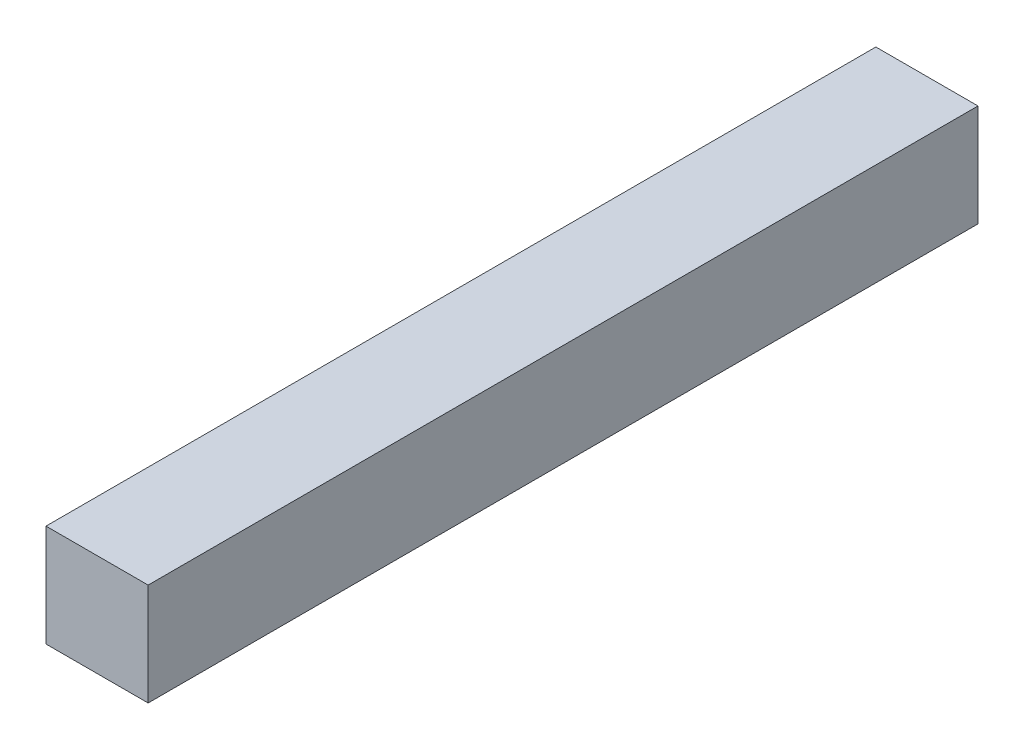
ISO-10303-21;
HEADER;
FILE_DESCRIPTION(('STEP AP214'),'2;1');
FILE_NAME('part.step','',(''),(''),'','','');
FILE_SCHEMA(('AUTOMOTIVE_DESIGN { 1 0 10303 214 1 1 1 1 }'));
ENDSEC;
DATA;
#1=APPLICATION_CONTEXT('core data for automotive mechanical design processes');
#2=APPLICATION_PROTOCOL_DEFINITION('international standard','automotive_design',2000,#1);
#3=PRODUCT_CONTEXT('',#1,'mechanical');
#4=PRODUCT('Part','Part','',(#3));
#5=PRODUCT_RELATED_PRODUCT_CATEGORY('part','',(#4));
#6=PRODUCT_DEFINITION_FORMATION('','',#4);
#7=PRODUCT_DEFINITION_CONTEXT('part definition',#1,'design');
#8=PRODUCT_DEFINITION('design','',#6,#7);
#9=PRODUCT_DEFINITION_SHAPE('','',#8);
#10=(LENGTH_UNIT() NAMED_UNIT(*) SI_UNIT(.MILLI.,.METRE.));
#11=(NAMED_UNIT(*) PLANE_ANGLE_UNIT() SI_UNIT($,.RADIAN.));
#12=(NAMED_UNIT(*) SI_UNIT($,.STERADIAN.) SOLID_ANGLE_UNIT());
#13=UNCERTAINTY_MEASURE_WITH_UNIT(LENGTH_MEASURE(1.E-05),#10,'distance_accuracy_value','');
#14=(GEOMETRIC_REPRESENTATION_CONTEXT(3) GLOBAL_UNCERTAINTY_ASSIGNED_CONTEXT((#13)) GLOBAL_UNIT_ASSIGNED_CONTEXT((#10,
#11,#12)) REPRESENTATION_CONTEXT('',''));
#15=CARTESIAN_POINT('',(0.,0.,0.));
#16=DIRECTION('',(0.,0.,1.));
#17=DIRECTION('',(1.,0.,0.));
#18=AXIS2_PLACEMENT_3D('',#15,#16,#17);
#19=CARTESIAN_POINT('',(0.,0.,65.));
#20=DIRECTION('',(1.,0.,0.));
#21=DIRECTION('',(0.,0.,-1.));
#22=AXIS2_PLACEMENT_3D('',#19,#20,#21);
#23=PLANE('',#22);
#24=DIRECTION('',(0.,-1.,0.));
#25=VECTOR('',#24,1.);
#26=CARTESIAN_POINT('',(0.,0.,0.));
#27=LINE('',#26,#25);
#28=CARTESIAN_POINT('',(0.,8.,0.));
#29=VERTEX_POINT('',#28);
#30=CARTESIAN_POINT('',(0.,0.,0.));
#31=VERTEX_POINT('',#30);
#32=EDGE_CURVE('E107',#29,#31,#27,.T.);
#33=ORIENTED_EDGE('',*,*,#32,.T.);
#34=DIRECTION('',(0.,0.,-1.));
#35=VECTOR('',#34,1.);
#36=CARTESIAN_POINT('',(0.,0.,65.));
#37=LINE('',#36,#35);
#38=CARTESIAN_POINT('',(0.,0.,65.));
#39=VERTEX_POINT('',#38);
#40=EDGE_CURVE('E11',#39,#31,#37,.T.);
#41=ORIENTED_EDGE('',*,*,#40,.F.);
#42=DIRECTION('',(0.,-1.,0.));
#43=VECTOR('',#42,1.);
#44=CARTESIAN_POINT('',(0.,0.,65.));
#45=LINE('',#44,#43);
#46=CARTESIAN_POINT('',(0.,8.,65.));
#47=VERTEX_POINT('',#46);
#48=EDGE_CURVE('E91',#47,#39,#45,.T.);
#49=ORIENTED_EDGE('',*,*,#48,.F.);
#50=DIRECTION('',(0.,0.,-1.));
#51=VECTOR('',#50,1.);
#52=CARTESIAN_POINT('',(0.,8.,65.));
#53=LINE('',#52,#51);
#54=EDGE_CURVE('E103',#47,#29,#53,.T.);
#55=ORIENTED_EDGE('',*,*,#54,.T.);
#56=EDGE_LOOP('',(#33,#41,#49,#55));
#57=FACE_BOUND('',#56,.T.);
#58=ADVANCED_FACE('F39',(#57),#23,.F.);
#59=CARTESIAN_POINT('',(0.,0.,65.));
#60=DIRECTION('',(0.,1.,0.));
#61=DIRECTION('',(0.,0.,1.));
#62=AXIS2_PLACEMENT_3D('',#59,#60,#61);
#63=PLANE('',#62);
#64=DIRECTION('',(1.,0.,0.));
#65=VECTOR('',#64,1.);
#66=CARTESIAN_POINT('',(0.,0.,0.));
#67=LINE('',#66,#65);
#68=CARTESIAN_POINT('',(8.,0.,0.));
#69=VERTEX_POINT('',#68);
#70=EDGE_CURVE('E96',#31,#69,#67,.T.);
#71=ORIENTED_EDGE('',*,*,#70,.T.);
#72=DIRECTION('',(0.,0.,-1.));
#73=VECTOR('',#72,1.);
#74=CARTESIAN_POINT('',(8.,0.,65.));
#75=LINE('',#74,#73);
#76=CARTESIAN_POINT('',(8.,0.,65.));
#77=VERTEX_POINT('',#76);
#78=EDGE_CURVE('E48',#77,#69,#75,.T.);
#79=ORIENTED_EDGE('',*,*,#78,.F.);
#80=DIRECTION('',(1.,0.,0.));
#81=VECTOR('',#80,1.);
#82=CARTESIAN_POINT('',(0.,0.,65.));
#83=LINE('',#82,#81);
#84=EDGE_CURVE('E86',#39,#77,#83,.T.);
#85=ORIENTED_EDGE('',*,*,#84,.F.);
#86=ORIENTED_EDGE('',*,*,#40,.T.);
#87=EDGE_LOOP('',(#71,#79,#85,#86));
#88=FACE_BOUND('',#87,.T.);
#89=ADVANCED_FACE('F95',(#88),#63,.F.);
#90=CARTESIAN_POINT('',(8.,0.,65.));
#91=DIRECTION('',(-1.,0.,0.));
#92=DIRECTION('',(0.,0.,1.));
#93=AXIS2_PLACEMENT_3D('',#90,#91,#92);
#94=PLANE('',#93);
#95=DIRECTION('',(0.,1.,0.));
#96=VECTOR('',#95,1.);
#97=CARTESIAN_POINT('',(8.,0.,0.));
#98=LINE('',#97,#96);
#99=CARTESIAN_POINT('',(8.,8.,0.));
#100=VERTEX_POINT('',#99);
#101=EDGE_CURVE('E73',#69,#100,#98,.T.);
#102=ORIENTED_EDGE('',*,*,#101,.T.);
#103=DIRECTION('',(0.,0.,-1.));
#104=VECTOR('',#103,1.);
#105=CARTESIAN_POINT('',(8.,8.,65.));
#106=LINE('',#105,#104);
#107=CARTESIAN_POINT('',(8.,8.,65.));
#108=VERTEX_POINT('',#107);
#109=EDGE_CURVE('E98',#108,#100,#106,.T.);
#110=ORIENTED_EDGE('',*,*,#109,.F.);
#111=DIRECTION('',(0.,1.,0.));
#112=VECTOR('',#111,1.);
#113=CARTESIAN_POINT('',(8.,0.,65.));
#114=LINE('',#113,#112);
#115=EDGE_CURVE('E89',#77,#108,#114,.T.);
#116=ORIENTED_EDGE('',*,*,#115,.F.);
#117=ORIENTED_EDGE('',*,*,#78,.T.);
#118=EDGE_LOOP('',(#102,#110,#116,#117));
#119=FACE_BOUND('',#118,.T.);
#120=ADVANCED_FACE('F99',(#119),#94,.F.);
#121=CARTESIAN_POINT('',(0.,8.,65.));
#122=DIRECTION('',(0.,-1.,0.));
#123=DIRECTION('',(0.,0.,-1.));
#124=AXIS2_PLACEMENT_3D('',#121,#122,#123);
#125=PLANE('',#124);
#126=DIRECTION('',(-1.,0.,0.));
#127=VECTOR('',#126,1.);
#128=CARTESIAN_POINT('',(0.,8.,0.));
#129=LINE('',#128,#127);
#130=EDGE_CURVE('E79',#100,#29,#129,.T.);
#131=ORIENTED_EDGE('',*,*,#130,.T.);
#132=ORIENTED_EDGE('',*,*,#54,.F.);
#133=DIRECTION('',(-1.,0.,0.));
#134=VECTOR('',#133,1.);
#135=CARTESIAN_POINT('',(0.,8.,65.));
#136=LINE('',#135,#134);
#137=EDGE_CURVE('E56',#108,#47,#136,.T.);
#138=ORIENTED_EDGE('',*,*,#137,.F.);
#139=ORIENTED_EDGE('',*,*,#109,.T.);
#140=EDGE_LOOP('',(#131,#132,#138,#139));
#141=FACE_BOUND('',#140,.T.);
#142=ADVANCED_FACE('F120',(#141),#125,.F.);
#143=CARTESIAN_POINT('',(0.,0.,65.));
#144=DIRECTION('',(0.,0.,-1.));
#145=DIRECTION('',(-1.,0.,0.));
#146=AXIS2_PLACEMENT_3D('',#143,#144,#145);
#147=PLANE('',#146);
#148=ORIENTED_EDGE('',*,*,#48,.T.);
#149=ORIENTED_EDGE('',*,*,#84,.T.);
#150=ORIENTED_EDGE('',*,*,#115,.T.);
#151=ORIENTED_EDGE('',*,*,#137,.T.);
#152=EDGE_LOOP('',(#148,#149,#150,#151));
#153=FACE_BOUND('',#152,.T.);
#154=ADVANCED_FACE('F87',(#153),#147,.F.);
#155=CARTESIAN_POINT('',(0.,0.,0.));
#156=DIRECTION('',(0.,0.,-1.));
#157=DIRECTION('',(-1.,0.,0.));
#158=AXIS2_PLACEMENT_3D('',#155,#156,#157);
#159=PLANE('',#158);
#160=ORIENTED_EDGE('',*,*,#32,.F.);
#161=ORIENTED_EDGE('',*,*,#130,.F.);
#162=ORIENTED_EDGE('',*,*,#101,.F.);
#163=ORIENTED_EDGE('',*,*,#70,.F.);
#164=EDGE_LOOP('',(#160,#161,#162,#163));
#165=FACE_BOUND('',#164,.T.);
#166=ADVANCED_FACE('F123',(#165),#159,.T.);
#167=CLOSED_SHELL('',(#58,#89,#120,#142,#154,#166));
#168=MANIFOLD_SOLID_BREP('B2',#167);
#169=ADVANCED_BREP_SHAPE_REPRESENTATION('',(#18,#168),#14);
#170=SHAPE_DEFINITION_REPRESENTATION(#9,#169);
ENDSEC;
END-ISO-10303-21;
